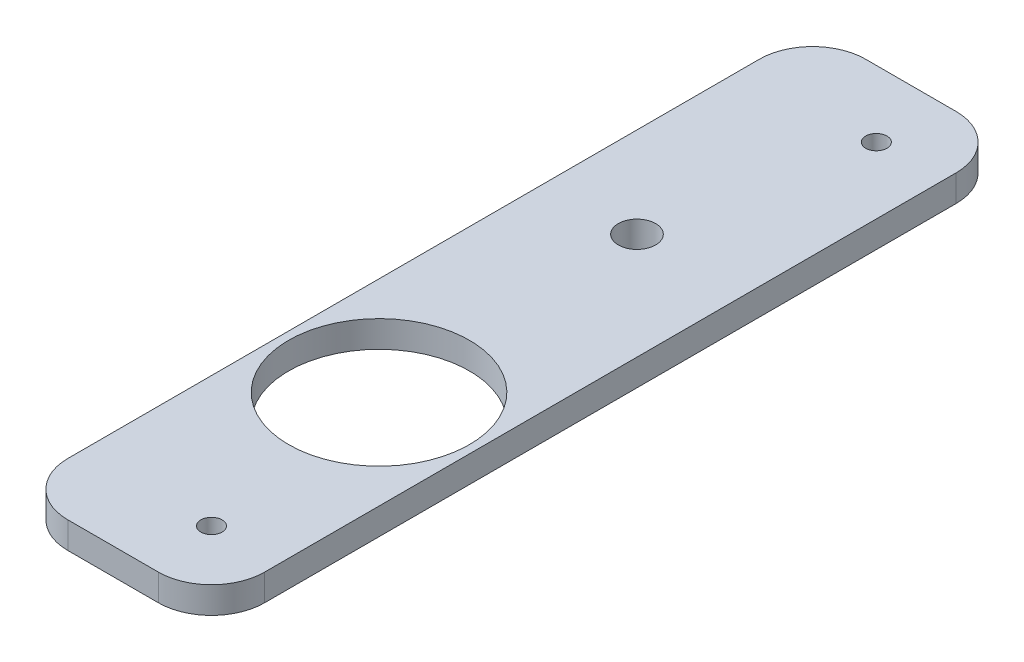
ISO-10303-21;
HEADER;
FILE_DESCRIPTION(('STEP AP214'),'2;1');
FILE_NAME('part.step','',(''),(''),'','','');
FILE_SCHEMA(('AUTOMOTIVE_DESIGN { 1 0 10303 214 1 1 1 1 }'));
ENDSEC;
DATA;
#1=APPLICATION_CONTEXT('core data for automotive mechanical design processes');
#2=APPLICATION_PROTOCOL_DEFINITION('international standard','automotive_design',2000,#1);
#3=PRODUCT_CONTEXT('',#1,'mechanical');
#4=PRODUCT('Part','Part','',(#3));
#5=PRODUCT_RELATED_PRODUCT_CATEGORY('part','',(#4));
#6=PRODUCT_DEFINITION_FORMATION('','',#4);
#7=PRODUCT_DEFINITION_CONTEXT('part definition',#1,'design');
#8=PRODUCT_DEFINITION('design','',#6,#7);
#9=PRODUCT_DEFINITION_SHAPE('','',#8);
#10=(LENGTH_UNIT() NAMED_UNIT(*) SI_UNIT(.MILLI.,.METRE.));
#11=(NAMED_UNIT(*) PLANE_ANGLE_UNIT() SI_UNIT($,.RADIAN.));
#12=(NAMED_UNIT(*) SI_UNIT($,.STERADIAN.) SOLID_ANGLE_UNIT());
#13=UNCERTAINTY_MEASURE_WITH_UNIT(LENGTH_MEASURE(1.E-05),#10,'distance_accuracy_value','');
#14=(GEOMETRIC_REPRESENTATION_CONTEXT(3) GLOBAL_UNCERTAINTY_ASSIGNED_CONTEXT((#13)) GLOBAL_UNIT_ASSIGNED_CONTEXT((#10,
#11,#12)) REPRESENTATION_CONTEXT('',''));
#15=CARTESIAN_POINT('',(0.,0.,0.));
#16=DIRECTION('',(0.,0.,1.));
#17=DIRECTION('',(1.,0.,0.));
#18=AXIS2_PLACEMENT_3D('',#15,#16,#17);
#19=CARTESIAN_POINT('',(0.,5.,0.));
#20=DIRECTION('',(0.,1.,0.));
#21=DIRECTION('',(0.,0.,1.));
#22=AXIS2_PLACEMENT_3D('',#19,#20,#21);
#23=PLANE('',#22);
#24=CARTESIAN_POINT('',(6.00000000000001,5.,-62.5));
#25=DIRECTION('',(0.,1.,0.));
#26=DIRECTION('',(0.,0.,1.));
#27=AXIS2_PLACEMENT_3D('',#24,#25,#26);
#28=CIRCLE('',#27,2.);
#29=CARTESIAN_POINT('',(6.00000000000001,5.,-60.5));
#30=VERTEX_POINT('',#29);
#31=EDGE_CURVE('E190',#30,#30,#28,.T.);
#32=ORIENTED_EDGE('',*,*,#31,.F.);
#33=EDGE_LOOP('',(#32));
#34=FACE_BOUND('',#33,.T.);
#35=CARTESIAN_POINT('',(6.00000000000001,5.,62.5));
#36=DIRECTION('',(0.,1.,0.));
#37=DIRECTION('',(0.,0.,-1.));
#38=AXIS2_PLACEMENT_3D('',#35,#36,#37);
#39=CIRCLE('',#38,2.);
#40=CARTESIAN_POINT('',(6.00000000000001,5.,60.5));
#41=VERTEX_POINT('',#40);
#42=EDGE_CURVE('E198',#41,#41,#39,.T.);
#43=ORIENTED_EDGE('',*,*,#42,.F.);
#44=EDGE_LOOP('',(#43));
#45=FACE_BOUND('',#44,.T.);
#46=CARTESIAN_POINT('',(-1.50000000000001,5.,-25.));
#47=DIRECTION('',(0.,1.,0.));
#48=DIRECTION('',(0.,0.,1.));
#49=AXIS2_PLACEMENT_3D('',#46,#47,#48);
#50=CIRCLE('',#49,3.5);
#51=CARTESIAN_POINT('',(-1.50000000000001,5.,-21.5));
#52=VERTEX_POINT('',#51);
#53=EDGE_CURVE('E145',#52,#52,#50,.T.);
#54=ORIENTED_EDGE('',*,*,#53,.F.);
#55=EDGE_LOOP('',(#54));
#56=FACE_BOUND('',#55,.T.);
#57=DIRECTION('',(0.,0.,-1.));
#58=VECTOR('',#57,1.);
#59=CARTESIAN_POINT('',(18.5,5.,-75.));
#60=LINE('',#59,#58);
#61=CARTESIAN_POINT('',(18.5,5.,65.));
#62=VERTEX_POINT('',#61);
#63=CARTESIAN_POINT('',(18.5,5.,-65.));
#64=VERTEX_POINT('',#63);
#65=EDGE_CURVE('E151',#62,#64,#60,.T.);
#66=ORIENTED_EDGE('',*,*,#65,.T.);
#67=CARTESIAN_POINT('',(8.49999999999998,5.,-65.));
#68=DIRECTION('',(0.,1.,0.));
#69=DIRECTION('',(0.,0.,1.));
#70=AXIS2_PLACEMENT_3D('',#67,#68,#69);
#71=CIRCLE('',#70,10.);
#72=CARTESIAN_POINT('',(8.49999999999998,5.,-75.));
#73=VERTEX_POINT('',#72);
#74=EDGE_CURVE('E175',#64,#73,#71,.T.);
#75=ORIENTED_EDGE('',*,*,#74,.T.);
#76=DIRECTION('',(-1.,0.,0.));
#77=VECTOR('',#76,1.);
#78=CARTESIAN_POINT('',(-18.5,5.,-75.));
#79=LINE('',#78,#77);
#80=CARTESIAN_POINT('',(-8.50000000000001,5.,-75.));
#81=VERTEX_POINT('',#80);
#82=EDGE_CURVE('E128',#73,#81,#79,.T.);
#83=ORIENTED_EDGE('',*,*,#82,.T.);
#84=CARTESIAN_POINT('',(-8.50000000000001,5.,-65.));
#85=DIRECTION('',(0.,1.,0.));
#86=DIRECTION('',(0.,0.,1.));
#87=AXIS2_PLACEMENT_3D('',#84,#85,#86);
#88=CIRCLE('',#87,10.);
#89=CARTESIAN_POINT('',(-18.5,5.,-65.));
#90=VERTEX_POINT('',#89);
#91=EDGE_CURVE('E172',#81,#90,#88,.T.);
#92=ORIENTED_EDGE('',*,*,#91,.T.);
#93=DIRECTION('',(0.,0.,1.));
#94=VECTOR('',#93,1.);
#95=CARTESIAN_POINT('',(-18.5,5.,-75.));
#96=LINE('',#95,#94);
#97=CARTESIAN_POINT('',(-18.5,5.,65.));
#98=VERTEX_POINT('',#97);
#99=EDGE_CURVE('E225',#90,#98,#96,.T.);
#100=ORIENTED_EDGE('',*,*,#99,.T.);
#101=CARTESIAN_POINT('',(-8.5,5.,65.));
#102=DIRECTION('',(0.,1.,0.));
#103=DIRECTION('',(0.,0.,1.));
#104=AXIS2_PLACEMENT_3D('',#101,#102,#103);
#105=CIRCLE('',#104,10.);
#106=CARTESIAN_POINT('',(-8.5,5.,75.));
#107=VERTEX_POINT('',#106);
#108=EDGE_CURVE('E62',#98,#107,#105,.T.);
#109=ORIENTED_EDGE('',*,*,#108,.T.);
#110=DIRECTION('',(1.,0.,0.));
#111=VECTOR('',#110,1.);
#112=CARTESIAN_POINT('',(-18.5,5.,75.));
#113=LINE('',#112,#111);
#114=CARTESIAN_POINT('',(8.5,5.,75.));
#115=VERTEX_POINT('',#114);
#116=EDGE_CURVE('E153',#107,#115,#113,.T.);
#117=ORIENTED_EDGE('',*,*,#116,.T.);
#118=CARTESIAN_POINT('',(8.5,5.,65.));
#119=DIRECTION('',(0.,1.,0.));
#120=DIRECTION('',(0.,0.,1.));
#121=AXIS2_PLACEMENT_3D('',#118,#119,#120);
#122=CIRCLE('',#121,10.);
#123=EDGE_CURVE('E169',#115,#62,#122,.T.);
#124=ORIENTED_EDGE('',*,*,#123,.T.);
#125=EDGE_LOOP('',(#66,#75,#83,#92,#100,#109,#117,#124));
#126=FACE_BOUND('',#125,.T.);
#127=CARTESIAN_POINT('',(0.,5.,25.));
#128=DIRECTION('',(0.,1.,0.));
#129=DIRECTION('',(0.,0.,1.));
#130=AXIS2_PLACEMENT_3D('',#127,#128,#129);
#131=CIRCLE('',#130,17.);
#132=CARTESIAN_POINT('',(0.,5.,42.));
#133=VERTEX_POINT('',#132);
#134=EDGE_CURVE('E206',#133,#133,#131,.T.);
#135=ORIENTED_EDGE('',*,*,#134,.F.);
#136=EDGE_LOOP('',(#135));
#137=FACE_BOUND('',#136,.T.);
#138=ADVANCED_FACE('F39',(#34,#45,#56,#126,#137),#23,.T.);
#139=CARTESIAN_POINT('',(0.,0.,0.));
#140=DIRECTION('',(0.,1.,0.));
#141=DIRECTION('',(0.,0.,1.));
#142=AXIS2_PLACEMENT_3D('',#139,#140,#141);
#143=PLANE('',#142);
#144=CARTESIAN_POINT('',(6.00000000000001,0.,-62.5));
#145=DIRECTION('',(0.,1.,0.));
#146=DIRECTION('',(0.,0.,1.));
#147=AXIS2_PLACEMENT_3D('',#144,#145,#146);
#148=CIRCLE('',#147,2.);
#149=CARTESIAN_POINT('',(6.00000000000001,0.,-60.5));
#150=VERTEX_POINT('',#149);
#151=EDGE_CURVE('E43',#150,#150,#148,.T.);
#152=ORIENTED_EDGE('',*,*,#151,.T.);
#153=EDGE_LOOP('',(#152));
#154=FACE_BOUND('',#153,.T.);
#155=CARTESIAN_POINT('',(6.00000000000001,0.,62.5));
#156=DIRECTION('',(0.,1.,0.));
#157=DIRECTION('',(0.,0.,1.));
#158=AXIS2_PLACEMENT_3D('',#155,#156,#157);
#159=CIRCLE('',#158,2.);
#160=CARTESIAN_POINT('',(6.00000000000001,0.,64.5));
#161=VERTEX_POINT('',#160);
#162=EDGE_CURVE('E187',#161,#161,#159,.T.);
#163=ORIENTED_EDGE('',*,*,#162,.T.);
#164=EDGE_LOOP('',(#163));
#165=FACE_BOUND('',#164,.T.);
#166=DIRECTION('',(-1.,0.,0.));
#167=VECTOR('',#166,1.);
#168=CARTESIAN_POINT('',(-18.5,0.,-75.));
#169=LINE('',#168,#167);
#170=CARTESIAN_POINT('',(8.49999999999998,0.,-75.));
#171=VERTEX_POINT('',#170);
#172=CARTESIAN_POINT('',(-8.50000000000001,0.,-75.));
#173=VERTEX_POINT('',#172);
#174=EDGE_CURVE('E125',#171,#173,#169,.T.);
#175=ORIENTED_EDGE('',*,*,#174,.F.);
#176=CARTESIAN_POINT('',(8.49999999999998,0.,-65.));
#177=DIRECTION('',(0.,1.,0.));
#178=DIRECTION('',(0.,0.,1.));
#179=AXIS2_PLACEMENT_3D('',#176,#177,#178);
#180=CIRCLE('',#179,10.);
#181=CARTESIAN_POINT('',(18.5,0.,-65.));
#182=VERTEX_POINT('',#181);
#183=EDGE_CURVE('E107',#171,#182,#180,.F.);
#184=ORIENTED_EDGE('',*,*,#183,.T.);
#185=DIRECTION('',(0.,0.,-1.));
#186=VECTOR('',#185,1.);
#187=CARTESIAN_POINT('',(18.5,0.,-75.));
#188=LINE('',#187,#186);
#189=CARTESIAN_POINT('',(18.5,0.,65.));
#190=VERTEX_POINT('',#189);
#191=EDGE_CURVE('E138',#190,#182,#188,.T.);
#192=ORIENTED_EDGE('',*,*,#191,.F.);
#193=CARTESIAN_POINT('',(8.5,0.,65.));
#194=DIRECTION('',(0.,1.,0.));
#195=DIRECTION('',(0.,0.,1.));
#196=AXIS2_PLACEMENT_3D('',#193,#194,#195);
#197=CIRCLE('',#196,10.);
#198=CARTESIAN_POINT('',(8.5,0.,75.));
#199=VERTEX_POINT('',#198);
#200=EDGE_CURVE('E157',#190,#199,#197,.F.);
#201=ORIENTED_EDGE('',*,*,#200,.T.);
#202=DIRECTION('',(1.,0.,0.));
#203=VECTOR('',#202,1.);
#204=CARTESIAN_POINT('',(-18.5,0.,75.));
#205=LINE('',#204,#203);
#206=CARTESIAN_POINT('',(-8.5,0.,75.));
#207=VERTEX_POINT('',#206);
#208=EDGE_CURVE('E143',#207,#199,#205,.T.);
#209=ORIENTED_EDGE('',*,*,#208,.F.);
#210=CARTESIAN_POINT('',(-8.5,0.,65.));
#211=DIRECTION('',(0.,1.,0.));
#212=DIRECTION('',(0.,0.,1.));
#213=AXIS2_PLACEMENT_3D('',#210,#211,#212);
#214=CIRCLE('',#213,10.);
#215=CARTESIAN_POINT('',(-18.5,0.,65.));
#216=VERTEX_POINT('',#215);
#217=EDGE_CURVE('E130',#207,#216,#214,.F.);
#218=ORIENTED_EDGE('',*,*,#217,.T.);
#219=DIRECTION('',(0.,0.,1.));
#220=VECTOR('',#219,1.);
#221=CARTESIAN_POINT('',(-18.5,0.,-75.));
#222=LINE('',#221,#220);
#223=CARTESIAN_POINT('',(-18.5,0.,-65.));
#224=VERTEX_POINT('',#223);
#225=EDGE_CURVE('E137',#224,#216,#222,.T.);
#226=ORIENTED_EDGE('',*,*,#225,.F.);
#227=CARTESIAN_POINT('',(-8.50000000000001,0.,-65.));
#228=DIRECTION('',(0.,1.,0.));
#229=DIRECTION('',(0.,0.,1.));
#230=AXIS2_PLACEMENT_3D('',#227,#228,#229);
#231=CIRCLE('',#230,10.);
#232=EDGE_CURVE('E119',#224,#173,#231,.F.);
#233=ORIENTED_EDGE('',*,*,#232,.T.);
#234=EDGE_LOOP('',(#175,#184,#192,#201,#209,#218,#226,#233));
#235=FACE_BOUND('',#234,.T.);
#236=CARTESIAN_POINT('',(-1.50000000000001,0.,-25.));
#237=DIRECTION('',(0.,1.,0.));
#238=DIRECTION('',(0.,0.,1.));
#239=AXIS2_PLACEMENT_3D('',#236,#237,#238);
#240=CIRCLE('',#239,3.5);
#241=CARTESIAN_POINT('',(-1.50000000000001,0.,-21.5));
#242=VERTEX_POINT('',#241);
#243=EDGE_CURVE('E210',#242,#242,#240,.T.);
#244=ORIENTED_EDGE('',*,*,#243,.T.);
#245=EDGE_LOOP('',(#244));
#246=FACE_BOUND('',#245,.T.);
#247=CARTESIAN_POINT('',(0.,0.,25.));
#248=DIRECTION('',(0.,1.,0.));
#249=DIRECTION('',(0.,0.,1.));
#250=AXIS2_PLACEMENT_3D('',#247,#248,#249);
#251=CIRCLE('',#250,17.);
#252=CARTESIAN_POINT('',(0.,0.,42.));
#253=VERTEX_POINT('',#252);
#254=EDGE_CURVE('E196',#253,#253,#251,.T.);
#255=ORIENTED_EDGE('',*,*,#254,.T.);
#256=EDGE_LOOP('',(#255));
#257=FACE_BOUND('',#256,.T.);
#258=ADVANCED_FACE('F133',(#154,#165,#235,#246,#257),#143,.F.);
#259=CARTESIAN_POINT('',(18.5,5.,-75.));
#260=DIRECTION('',(-1.,0.,0.));
#261=DIRECTION('',(0.,0.,1.));
#262=AXIS2_PLACEMENT_3D('',#259,#260,#261);
#263=PLANE('',#262);
#264=ORIENTED_EDGE('',*,*,#191,.T.);
#265=DIRECTION('',(0.,-1.,0.));
#266=VECTOR('',#265,1.);
#267=CARTESIAN_POINT('',(18.5,5.,-65.));
#268=LINE('',#267,#266);
#269=EDGE_CURVE('E112',#182,#64,#268,.F.);
#270=ORIENTED_EDGE('',*,*,#269,.T.);
#271=ORIENTED_EDGE('',*,*,#65,.F.);
#272=DIRECTION('',(0.,-1.,0.));
#273=VECTOR('',#272,1.);
#274=CARTESIAN_POINT('',(18.5,5.,65.));
#275=LINE('',#274,#273);
#276=EDGE_CURVE('E118',#62,#190,#275,.T.);
#277=ORIENTED_EDGE('',*,*,#276,.T.);
#278=EDGE_LOOP('',(#264,#270,#271,#277));
#279=FACE_BOUND('',#278,.T.);
#280=ADVANCED_FACE('F236',(#279),#263,.F.);
#281=CARTESIAN_POINT('',(-18.5,5.,-75.));
#282=DIRECTION('',(0.,0.,1.));
#283=DIRECTION('',(1.,0.,0.));
#284=AXIS2_PLACEMENT_3D('',#281,#282,#283);
#285=PLANE('',#284);
#286=ORIENTED_EDGE('',*,*,#82,.F.);
#287=DIRECTION('',(0.,-1.,0.));
#288=VECTOR('',#287,1.);
#289=CARTESIAN_POINT('',(8.49999999999998,5.,-75.));
#290=LINE('',#289,#288);
#291=EDGE_CURVE('E111',#73,#171,#290,.T.);
#292=ORIENTED_EDGE('',*,*,#291,.T.);
#293=ORIENTED_EDGE('',*,*,#174,.T.);
#294=DIRECTION('',(0.,-1.,0.));
#295=VECTOR('',#294,1.);
#296=CARTESIAN_POINT('',(-8.50000000000001,5.,-75.));
#297=LINE('',#296,#295);
#298=EDGE_CURVE('E131',#173,#81,#297,.F.);
#299=ORIENTED_EDGE('',*,*,#298,.T.);
#300=EDGE_LOOP('',(#286,#292,#293,#299));
#301=FACE_BOUND('',#300,.T.);
#302=ADVANCED_FACE('F124',(#301),#285,.F.);
#303=CARTESIAN_POINT('',(-18.5,5.,-75.));
#304=DIRECTION('',(1.,0.,0.));
#305=DIRECTION('',(0.,0.,-1.));
#306=AXIS2_PLACEMENT_3D('',#303,#304,#305);
#307=PLANE('',#306);
#308=ORIENTED_EDGE('',*,*,#99,.F.);
#309=DIRECTION('',(0.,-1.,0.));
#310=VECTOR('',#309,1.);
#311=CARTESIAN_POINT('',(-18.5,5.,-65.));
#312=LINE('',#311,#310);
#313=EDGE_CURVE('E181',#90,#224,#312,.T.);
#314=ORIENTED_EDGE('',*,*,#313,.T.);
#315=ORIENTED_EDGE('',*,*,#225,.T.);
#316=DIRECTION('',(0.,-1.,0.));
#317=VECTOR('',#316,1.);
#318=CARTESIAN_POINT('',(-18.5,5.,65.));
#319=LINE('',#318,#317);
#320=EDGE_CURVE('E178',#216,#98,#319,.F.);
#321=ORIENTED_EDGE('',*,*,#320,.T.);
#322=EDGE_LOOP('',(#308,#314,#315,#321));
#323=FACE_BOUND('',#322,.T.);
#324=ADVANCED_FACE('F243',(#323),#307,.F.);
#325=CARTESIAN_POINT('',(-18.5,5.,75.));
#326=DIRECTION('',(0.,0.,-1.));
#327=DIRECTION('',(-1.,0.,0.));
#328=AXIS2_PLACEMENT_3D('',#325,#326,#327);
#329=PLANE('',#328);
#330=ORIENTED_EDGE('',*,*,#208,.T.);
#331=DIRECTION('',(0.,-1.,0.));
#332=VECTOR('',#331,1.);
#333=CARTESIAN_POINT('',(8.5,5.,75.));
#334=LINE('',#333,#332);
#335=EDGE_CURVE('E11',#199,#115,#334,.F.);
#336=ORIENTED_EDGE('',*,*,#335,.T.);
#337=ORIENTED_EDGE('',*,*,#116,.F.);
#338=DIRECTION('',(0.,-1.,0.));
#339=VECTOR('',#338,1.);
#340=CARTESIAN_POINT('',(-8.5,5.,75.));
#341=LINE('',#340,#339);
#342=EDGE_CURVE('E49',#107,#207,#341,.T.);
#343=ORIENTED_EDGE('',*,*,#342,.T.);
#344=EDGE_LOOP('',(#330,#336,#337,#343));
#345=FACE_BOUND('',#344,.T.);
#346=ADVANCED_FACE('F238',(#345),#329,.F.);
#347=CARTESIAN_POINT('',(-1.50000000000001,5.,-25.));
#348=DIRECTION('',(0.,-1.,0.));
#349=DIRECTION('',(0.,0.,-1.));
#350=AXIS2_PLACEMENT_3D('',#347,#348,#349);
#351=CYLINDRICAL_SURFACE('',#350,3.5);
#352=ORIENTED_EDGE('',*,*,#53,.T.);
#353=EDGE_LOOP('',(#352));
#354=FACE_BOUND('',#353,.T.);
#355=ORIENTED_EDGE('',*,*,#243,.F.);
#356=EDGE_LOOP('',(#355));
#357=FACE_BOUND('',#356,.T.);
#358=ADVANCED_FACE('F266',(#354,#357),#351,.F.);
#359=CARTESIAN_POINT('',(0.,5.,25.));
#360=DIRECTION('',(0.,-1.,0.));
#361=DIRECTION('',(0.,0.,-1.));
#362=AXIS2_PLACEMENT_3D('',#359,#360,#361);
#363=CYLINDRICAL_SURFACE('',#362,17.);
#364=ORIENTED_EDGE('',*,*,#134,.T.);
#365=EDGE_LOOP('',(#364));
#366=FACE_BOUND('',#365,.T.);
#367=ORIENTED_EDGE('',*,*,#254,.F.);
#368=EDGE_LOOP('',(#367));
#369=FACE_BOUND('',#368,.T.);
#370=ADVANCED_FACE('F254',(#366,#369),#363,.F.);
#371=CARTESIAN_POINT('',(8.49999999999998,5.,-65.));
#372=DIRECTION('',(0.,-1.,0.));
#373=DIRECTION('',(0.,0.,-1.));
#374=AXIS2_PLACEMENT_3D('',#371,#372,#373);
#375=CYLINDRICAL_SURFACE('',#374,10.);
#376=ORIENTED_EDGE('',*,*,#74,.F.);
#377=ORIENTED_EDGE('',*,*,#269,.F.);
#378=ORIENTED_EDGE('',*,*,#183,.F.);
#379=ORIENTED_EDGE('',*,*,#291,.F.);
#380=EDGE_LOOP('',(#376,#377,#378,#379));
#381=FACE_BOUND('',#380,.T.);
#382=ADVANCED_FACE('F110',(#381),#375,.T.);
#383=CARTESIAN_POINT('',(-8.50000000000001,5.,-65.));
#384=DIRECTION('',(0.,-1.,0.));
#385=DIRECTION('',(0.,0.,-1.));
#386=AXIS2_PLACEMENT_3D('',#383,#384,#385);
#387=CYLINDRICAL_SURFACE('',#386,10.);
#388=ORIENTED_EDGE('',*,*,#91,.F.);
#389=ORIENTED_EDGE('',*,*,#298,.F.);
#390=ORIENTED_EDGE('',*,*,#232,.F.);
#391=ORIENTED_EDGE('',*,*,#313,.F.);
#392=EDGE_LOOP('',(#388,#389,#390,#391));
#393=FACE_BOUND('',#392,.T.);
#394=ADVANCED_FACE('F247',(#393),#387,.T.);
#395=CARTESIAN_POINT('',(8.5,5.,65.));
#396=DIRECTION('',(0.,-1.,0.));
#397=DIRECTION('',(0.,0.,-1.));
#398=AXIS2_PLACEMENT_3D('',#395,#396,#397);
#399=CYLINDRICAL_SURFACE('',#398,10.);
#400=ORIENTED_EDGE('',*,*,#123,.F.);
#401=ORIENTED_EDGE('',*,*,#335,.F.);
#402=ORIENTED_EDGE('',*,*,#200,.F.);
#403=ORIENTED_EDGE('',*,*,#276,.F.);
#404=EDGE_LOOP('',(#400,#401,#402,#403));
#405=FACE_BOUND('',#404,.T.);
#406=ADVANCED_FACE('F234',(#405),#399,.T.);
#407=CARTESIAN_POINT('',(-8.5,5.,65.));
#408=DIRECTION('',(0.,-1.,0.));
#409=DIRECTION('',(0.,0.,-1.));
#410=AXIS2_PLACEMENT_3D('',#407,#408,#409);
#411=CYLINDRICAL_SURFACE('',#410,10.);
#412=ORIENTED_EDGE('',*,*,#108,.F.);
#413=ORIENTED_EDGE('',*,*,#320,.F.);
#414=ORIENTED_EDGE('',*,*,#217,.F.);
#415=ORIENTED_EDGE('',*,*,#342,.F.);
#416=EDGE_LOOP('',(#412,#413,#414,#415));
#417=FACE_BOUND('',#416,.T.);
#418=ADVANCED_FACE('F41',(#417),#411,.T.);
#419=CARTESIAN_POINT('',(6.00000000000001,-5.,62.5));
#420=DIRECTION('',(0.,1.,0.));
#421=DIRECTION('',(0.,0.,1.));
#422=AXIS2_PLACEMENT_3D('',#419,#420,#421);
#423=CYLINDRICAL_SURFACE('',#422,2.);
#424=ORIENTED_EDGE('',*,*,#42,.T.);
#425=EDGE_LOOP('',(#424));
#426=FACE_BOUND('',#425,.T.);
#427=ORIENTED_EDGE('',*,*,#162,.F.);
#428=EDGE_LOOP('',(#427));
#429=FACE_BOUND('',#428,.T.);
#430=ADVANCED_FACE('F326',(#426,#429),#423,.F.);
#431=CARTESIAN_POINT('',(6.00000000000001,-5.,-62.5));
#432=DIRECTION('',(0.,1.,0.));
#433=DIRECTION('',(0.,0.,1.));
#434=AXIS2_PLACEMENT_3D('',#431,#432,#433);
#435=CYLINDRICAL_SURFACE('',#434,2.);
#436=ORIENTED_EDGE('',*,*,#31,.T.);
#437=EDGE_LOOP('',(#436));
#438=FACE_BOUND('',#437,.T.);
#439=ORIENTED_EDGE('',*,*,#151,.F.);
#440=EDGE_LOOP('',(#439));
#441=FACE_BOUND('',#440,.T.);
#442=ADVANCED_FACE('F343',(#438,#441),#435,.F.);
#443=CLOSED_SHELL('',(#138,#258,#280,#302,#324,#346,#358,#370,#382,#394,#406,#418,#430,#442));
#444=MANIFOLD_SOLID_BREP('B2',#443);
#445=ADVANCED_BREP_SHAPE_REPRESENTATION('',(#18,#444),#14);
#446=SHAPE_DEFINITION_REPRESENTATION(#9,#445);
ENDSEC;
END-ISO-10303-21;
